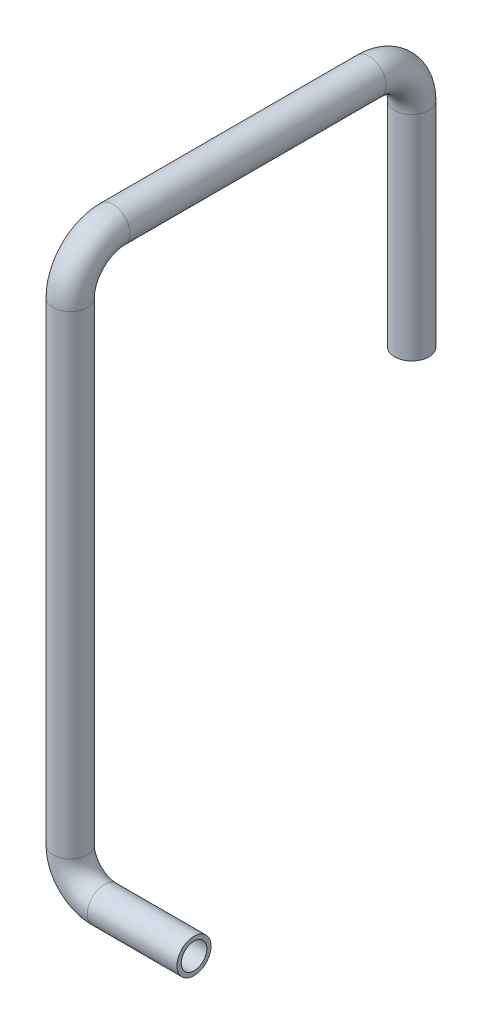
ISO-10303-21;
HEADER;
FILE_DESCRIPTION(('STEP AP214'),'2;1');
FILE_NAME('part.step','',(''),(''),'','','');
FILE_SCHEMA(('AUTOMOTIVE_DESIGN { 1 0 10303 214 1 1 1 1 }'));
ENDSEC;
DATA;
#1=APPLICATION_CONTEXT('core data for automotive mechanical design processes');
#2=APPLICATION_PROTOCOL_DEFINITION('international standard','automotive_design',2000,#1);
#3=PRODUCT_CONTEXT('',#1,'mechanical');
#4=PRODUCT('Part','Part','',(#3));
#5=PRODUCT_RELATED_PRODUCT_CATEGORY('part','',(#4));
#6=PRODUCT_DEFINITION_FORMATION('','',#4);
#7=PRODUCT_DEFINITION_CONTEXT('part definition',#1,'design');
#8=PRODUCT_DEFINITION('design','',#6,#7);
#9=PRODUCT_DEFINITION_SHAPE('','',#8);
#10=(LENGTH_UNIT() NAMED_UNIT(*) SI_UNIT(.MILLI.,.METRE.));
#11=(NAMED_UNIT(*) PLANE_ANGLE_UNIT() SI_UNIT($,.RADIAN.));
#12=(NAMED_UNIT(*) SI_UNIT($,.STERADIAN.) SOLID_ANGLE_UNIT());
#13=UNCERTAINTY_MEASURE_WITH_UNIT(LENGTH_MEASURE(1.E-05),#10,'distance_accuracy_value','');
#14=(GEOMETRIC_REPRESENTATION_CONTEXT(3) GLOBAL_UNCERTAINTY_ASSIGNED_CONTEXT((#13)) GLOBAL_UNIT_ASSIGNED_CONTEXT((#10,
#11,#12)) REPRESENTATION_CONTEXT('',''));
#15=CARTESIAN_POINT('',(0.,0.,0.));
#16=DIRECTION('',(0.,0.,1.));
#17=DIRECTION('',(1.,0.,0.));
#18=AXIS2_PLACEMENT_3D('',#15,#16,#17);
#19=CARTESIAN_POINT('',(59.,21.,40.));
#20=DIRECTION('',(1.,0.,0.));
#21=DIRECTION('',(0.,0.,-1.));
#22=AXIS2_PLACEMENT_3D('',#19,#20,#21);
#23=PLANE('',#22);
#24=CARTESIAN_POINT('',(59.,21.,40.));
#25=DIRECTION('',(1.,0.,0.));
#26=DIRECTION('',(0.,0.,-1.));
#27=AXIS2_PLACEMENT_3D('',#24,#25,#26);
#28=CIRCLE('',#27,3.);
#29=CARTESIAN_POINT('',(59.,21.,37.));
#30=VERTEX_POINT('',#29);
#31=EDGE_CURVE('E263',#30,#30,#28,.T.);
#32=ORIENTED_EDGE('',*,*,#31,.F.);
#33=EDGE_LOOP('',(#32));
#34=FACE_BOUND('',#33,.T.);
#35=CARTESIAN_POINT('',(59.,21.,40.));
#36=DIRECTION('',(1.,0.,0.));
#37=DIRECTION('',(0.,0.,-1.));
#38=AXIS2_PLACEMENT_3D('',#35,#36,#37);
#39=CIRCLE('',#38,4.);
#40=CARTESIAN_POINT('',(59.,21.,36.));
#41=VERTEX_POINT('',#40);
#42=EDGE_CURVE('E75',#41,#41,#39,.T.);
#43=ORIENTED_EDGE('',*,*,#42,.T.);
#44=EDGE_LOOP('',(#43));
#45=FACE_BOUND('',#44,.T.);
#46=ADVANCED_FACE('F52',(#34,#45),#23,.T.);
#47=CARTESIAN_POINT('',(30.,90.,-40.));
#48=DIRECTION('',(0.,1.,0.));
#49=DIRECTION('',(0.,0.,1.));
#50=AXIS2_PLACEMENT_3D('',#47,#48,#49);
#51=PLANE('',#50);
#52=CARTESIAN_POINT('',(30.,90.,-40.));
#53=DIRECTION('',(0.,1.,0.));
#54=DIRECTION('',(0.,0.,1.));
#55=AXIS2_PLACEMENT_3D('',#52,#53,#54);
#56=CIRCLE('',#55,3.);
#57=CARTESIAN_POINT('',(30.,90.,-37.));
#58=VERTEX_POINT('',#57);
#59=EDGE_CURVE('E73',#58,#58,#56,.T.);
#60=ORIENTED_EDGE('',*,*,#59,.T.);
#61=EDGE_LOOP('',(#60));
#62=FACE_BOUND('',#61,.T.);
#63=CARTESIAN_POINT('',(30.,90.,-40.));
#64=DIRECTION('',(0.,1.,0.));
#65=DIRECTION('',(0.,0.,1.));
#66=AXIS2_PLACEMENT_3D('',#63,#64,#65);
#67=CIRCLE('',#66,4.);
#68=CARTESIAN_POINT('',(30.,90.,-36.));
#69=VERTEX_POINT('',#68);
#70=EDGE_CURVE('E11',#69,#69,#67,.T.);
#71=ORIENTED_EDGE('',*,*,#70,.F.);
#72=EDGE_LOOP('',(#71));
#73=FACE_BOUND('',#72,.T.);
#74=ADVANCED_FACE('F149',(#62,#73),#51,.F.);
#75=CARTESIAN_POINT('',(59.,21.,40.));
#76=DIRECTION('',(-1.,0.,0.));
#77=DIRECTION('',(0.,0.,1.));
#78=AXIS2_PLACEMENT_3D('',#75,#76,#77);
#79=CYLINDRICAL_SURFACE('',#78,4.);
#80=CARTESIAN_POINT('',(38.,21.,40.));
#81=DIRECTION('',(-1.,0.,0.));
#82=DIRECTION('',(0.,0.,1.));
#83=AXIS2_PLACEMENT_3D('',#80,#81,#82);
#84=CIRCLE('',#83,4.);
#85=CARTESIAN_POINT('',(38.,17.,40.));
#86=VERTEX_POINT('',#85);
#87=EDGE_CURVE('E74',#86,#86,#84,.F.);
#88=ORIENTED_EDGE('',*,*,#87,.T.);
#89=EDGE_LOOP('',(#88));
#90=FACE_BOUND('',#89,.T.);
#91=ORIENTED_EDGE('',*,*,#42,.F.);
#92=EDGE_LOOP('',(#91));
#93=FACE_BOUND('',#92,.T.);
#94=ADVANCED_FACE('F155',(#90,#93),#79,.T.);
#95=CARTESIAN_POINT('',(38.,29.,40.));
#96=DIRECTION('',(0.,0.,-1.));
#97=DIRECTION('',(-1.,0.,0.));
#98=AXIS2_PLACEMENT_3D('',#95,#96,#97);
#99=TOROIDAL_SURFACE('',#98,8.,4.);
#100=CARTESIAN_POINT('',(30.,29.,40.));
#101=DIRECTION('',(0.,-1.,0.));
#102=DIRECTION('',(1.,0.,0.));
#103=AXIS2_PLACEMENT_3D('',#100,#101,#102);
#104=CIRCLE('',#103,4.);
#105=CARTESIAN_POINT('',(26.,29.,40.));
#106=VERTEX_POINT('',#105);
#107=EDGE_CURVE('E78',#106,#106,#104,.T.);
#108=CARTESIAN_POINT('',(38.,29.,40.));
#109=DIRECTION('',(0.,0.,-1.));
#110=DIRECTION('',(-1.,0.,0.));
#111=AXIS2_PLACEMENT_3D('',#108,#109,#110);
#112=CIRCLE('',#111,12.);
#113=EDGE_CURVE('',#86,#106,#112,.T.);
#114=ORIENTED_EDGE('',*,*,#87,.F.);
#115=ORIENTED_EDGE('',*,*,#107,.T.);
#116=ORIENTED_EDGE('',*,*,#113,.T.);
#117=ORIENTED_EDGE('',*,*,#113,.F.);
#118=EDGE_LOOP('',(#114,#116,#115,#117));
#119=FACE_BOUND('',#118,.T.);
#120=ADVANCED_FACE('F158',(#119),#99,.T.);
#121=CARTESIAN_POINT('',(30.,29.,40.));
#122=DIRECTION('',(0.,1.,0.));
#123=DIRECTION('',(0.,0.,1.));
#124=AXIS2_PLACEMENT_3D('',#121,#122,#123);
#125=CYLINDRICAL_SURFACE('',#124,4.);
#126=CARTESIAN_POINT('',(30.,140.,40.));
#127=DIRECTION('',(0.,1.,0.));
#128=DIRECTION('',(0.,0.,1.));
#129=AXIS2_PLACEMENT_3D('',#126,#127,#128);
#130=CIRCLE('',#129,4.);
#131=CARTESIAN_POINT('',(30.,140.,44.));
#132=VERTEX_POINT('',#131);
#133=EDGE_CURVE('E91',#132,#132,#130,.F.);
#134=ORIENTED_EDGE('',*,*,#133,.T.);
#135=EDGE_LOOP('',(#134));
#136=FACE_BOUND('',#135,.T.);
#137=ORIENTED_EDGE('',*,*,#107,.F.);
#138=EDGE_LOOP('',(#137));
#139=FACE_BOUND('',#138,.T.);
#140=ADVANCED_FACE('F109',(#136,#139),#125,.T.);
#141=CARTESIAN_POINT('',(30.,140.,30.));
#142=DIRECTION('',(-1.,0.,0.));
#143=DIRECTION('',(0.,0.,1.));
#144=AXIS2_PLACEMENT_3D('',#141,#142,#143);
#145=TOROIDAL_SURFACE('',#144,10.,4.);
#146=CARTESIAN_POINT('',(30.,150.,30.));
#147=DIRECTION('',(0.,0.,1.));
#148=DIRECTION('',(0.,-1.,0.));
#149=AXIS2_PLACEMENT_3D('',#146,#147,#148);
#150=CIRCLE('',#149,4.);
#151=CARTESIAN_POINT('',(30.,154.,30.));
#152=VERTEX_POINT('',#151);
#153=EDGE_CURVE('E68',#152,#152,#150,.T.);
#154=CARTESIAN_POINT('',(30.,140.,30.));
#155=DIRECTION('',(-1.,0.,0.));
#156=DIRECTION('',(0.,0.,1.));
#157=AXIS2_PLACEMENT_3D('',#154,#155,#156);
#158=CIRCLE('',#157,14.);
#159=EDGE_CURVE('',#132,#152,#158,.T.);
#160=ORIENTED_EDGE('',*,*,#133,.F.);
#161=ORIENTED_EDGE('',*,*,#153,.T.);
#162=ORIENTED_EDGE('',*,*,#159,.T.);
#163=ORIENTED_EDGE('',*,*,#159,.F.);
#164=EDGE_LOOP('',(#160,#162,#161,#163));
#165=FACE_BOUND('',#164,.T.);
#166=ADVANCED_FACE('F98',(#165),#145,.T.);
#167=CARTESIAN_POINT('',(30.,150.,30.));
#168=DIRECTION('',(0.,0.,-1.));
#169=DIRECTION('',(-1.,0.,0.));
#170=AXIS2_PLACEMENT_3D('',#167,#168,#169);
#171=CYLINDRICAL_SURFACE('',#170,4.);
#172=CARTESIAN_POINT('',(30.,150.,-30.));
#173=DIRECTION('',(0.,0.,-1.));
#174=DIRECTION('',(-1.,0.,0.));
#175=AXIS2_PLACEMENT_3D('',#172,#173,#174);
#176=CIRCLE('',#175,4.);
#177=CARTESIAN_POINT('',(30.,154.,-30.));
#178=VERTEX_POINT('',#177);
#179=EDGE_CURVE('E63',#178,#178,#176,.F.);
#180=ORIENTED_EDGE('',*,*,#179,.T.);
#181=EDGE_LOOP('',(#180));
#182=FACE_BOUND('',#181,.T.);
#183=ORIENTED_EDGE('',*,*,#153,.F.);
#184=EDGE_LOOP('',(#183));
#185=FACE_BOUND('',#184,.T.);
#186=ADVANCED_FACE('F101',(#182,#185),#171,.T.);
#187=CARTESIAN_POINT('',(30.,140.,-30.));
#188=DIRECTION('',(-1.,0.,0.));
#189=DIRECTION('',(0.,0.,1.));
#190=AXIS2_PLACEMENT_3D('',#187,#188,#189);
#191=TOROIDAL_SURFACE('',#190,10.,4.);
#192=CARTESIAN_POINT('',(30.,140.,-40.));
#193=DIRECTION('',(0.,1.,0.));
#194=DIRECTION('',(0.,0.,1.));
#195=AXIS2_PLACEMENT_3D('',#192,#193,#194);
#196=CIRCLE('',#195,4.);
#197=CARTESIAN_POINT('',(30.,140.,-44.));
#198=VERTEX_POINT('',#197);
#199=EDGE_CURVE('E58',#198,#198,#196,.T.);
#200=CARTESIAN_POINT('',(30.,140.,-30.));
#201=DIRECTION('',(-1.,0.,0.));
#202=DIRECTION('',(0.,0.,1.));
#203=AXIS2_PLACEMENT_3D('',#200,#201,#202);
#204=CIRCLE('',#203,14.);
#205=EDGE_CURVE('',#178,#198,#204,.T.);
#206=ORIENTED_EDGE('',*,*,#179,.F.);
#207=ORIENTED_EDGE('',*,*,#199,.T.);
#208=ORIENTED_EDGE('',*,*,#205,.T.);
#209=ORIENTED_EDGE('',*,*,#205,.F.);
#210=EDGE_LOOP('',(#206,#208,#207,#209));
#211=FACE_BOUND('',#210,.T.);
#212=ADVANCED_FACE('F103',(#211),#191,.T.);
#213=CARTESIAN_POINT('',(30.,140.,-40.));
#214=DIRECTION('',(0.,-1.,0.));
#215=DIRECTION('',(0.,0.,-1.));
#216=AXIS2_PLACEMENT_3D('',#213,#214,#215);
#217=CYLINDRICAL_SURFACE('',#216,4.);
#218=ORIENTED_EDGE('',*,*,#70,.T.);
#219=EDGE_LOOP('',(#218));
#220=FACE_BOUND('',#219,.T.);
#221=ORIENTED_EDGE('',*,*,#199,.F.);
#222=EDGE_LOOP('',(#221));
#223=FACE_BOUND('',#222,.T.);
#224=ADVANCED_FACE('F54',(#220,#223),#217,.T.);
#225=CARTESIAN_POINT('',(59.,21.,40.));
#226=DIRECTION('',(-1.,0.,0.));
#227=DIRECTION('',(0.,0.,1.));
#228=AXIS2_PLACEMENT_3D('',#225,#226,#227);
#229=CYLINDRICAL_SURFACE('',#228,3.);
#230=CARTESIAN_POINT('',(38.,21.,40.));
#231=DIRECTION('',(1.,0.,0.));
#232=DIRECTION('',(0.,0.,-1.));
#233=AXIS2_PLACEMENT_3D('',#230,#231,#232);
#234=CIRCLE('',#233,3.);
#235=CARTESIAN_POINT('',(38.,18.,40.));
#236=VERTEX_POINT('',#235);
#237=EDGE_CURVE('E262',#236,#236,#234,.T.);
#238=ORIENTED_EDGE('',*,*,#237,.F.);
#239=EDGE_LOOP('',(#238));
#240=FACE_BOUND('',#239,.T.);
#241=ORIENTED_EDGE('',*,*,#31,.T.);
#242=EDGE_LOOP('',(#241));
#243=FACE_BOUND('',#242,.T.);
#244=ADVANCED_FACE('F114',(#240,#243),#229,.F.);
#245=CARTESIAN_POINT('',(38.,29.,40.));
#246=DIRECTION('',(0.,0.,-1.));
#247=DIRECTION('',(-1.,0.,0.));
#248=AXIS2_PLACEMENT_3D('',#245,#246,#247);
#249=TOROIDAL_SURFACE('',#248,8.,3.);
#250=CARTESIAN_POINT('',(30.,29.,40.));
#251=DIRECTION('',(0.,-1.,0.));
#252=DIRECTION('',(0.,0.,-1.));
#253=AXIS2_PLACEMENT_3D('',#250,#251,#252);
#254=CIRCLE('',#253,3.);
#255=CARTESIAN_POINT('',(27.,29.,40.));
#256=VERTEX_POINT('',#255);
#257=EDGE_CURVE('E270',#256,#256,#254,.T.);
#258=CARTESIAN_POINT('',(38.,29.,40.));
#259=DIRECTION('',(0.,0.,-1.));
#260=DIRECTION('',(-1.,0.,0.));
#261=AXIS2_PLACEMENT_3D('',#258,#259,#260);
#262=CIRCLE('',#261,11.);
#263=EDGE_CURVE('',#236,#256,#262,.T.);
#264=ORIENTED_EDGE('',*,*,#237,.T.);
#265=ORIENTED_EDGE('',*,*,#257,.F.);
#266=ORIENTED_EDGE('',*,*,#263,.T.);
#267=ORIENTED_EDGE('',*,*,#263,.F.);
#268=EDGE_LOOP('',(#264,#266,#265,#267));
#269=FACE_BOUND('',#268,.T.);
#270=ADVANCED_FACE('F116',(#269),#249,.F.);
#271=CARTESIAN_POINT('',(30.,29.,40.));
#272=DIRECTION('',(0.,1.,0.));
#273=DIRECTION('',(0.,0.,1.));
#274=AXIS2_PLACEMENT_3D('',#271,#272,#273);
#275=CYLINDRICAL_SURFACE('',#274,3.);
#276=CARTESIAN_POINT('',(30.,140.,40.));
#277=DIRECTION('',(0.,-1.,0.));
#278=DIRECTION('',(0.,0.,-1.));
#279=AXIS2_PLACEMENT_3D('',#276,#277,#278);
#280=CIRCLE('',#279,3.);
#281=CARTESIAN_POINT('',(30.,140.,43.));
#282=VERTEX_POINT('',#281);
#283=EDGE_CURVE('E275',#282,#282,#280,.T.);
#284=ORIENTED_EDGE('',*,*,#283,.F.);
#285=EDGE_LOOP('',(#284));
#286=FACE_BOUND('',#285,.T.);
#287=ORIENTED_EDGE('',*,*,#257,.T.);
#288=EDGE_LOOP('',(#287));
#289=FACE_BOUND('',#288,.T.);
#290=ADVANCED_FACE('F123',(#286,#289),#275,.F.);
#291=CARTESIAN_POINT('',(30.,140.,30.));
#292=DIRECTION('',(-1.,0.,0.));
#293=DIRECTION('',(0.,0.,1.));
#294=AXIS2_PLACEMENT_3D('',#291,#292,#293);
#295=TOROIDAL_SURFACE('',#294,10.,3.);
#296=CARTESIAN_POINT('',(30.,150.,30.));
#297=DIRECTION('',(0.,0.,1.));
#298=DIRECTION('',(0.,-1.,0.));
#299=AXIS2_PLACEMENT_3D('',#296,#297,#298);
#300=CIRCLE('',#299,3.);
#301=CARTESIAN_POINT('',(30.,153.,30.));
#302=VERTEX_POINT('',#301);
#303=EDGE_CURVE('E274',#302,#302,#300,.T.);
#304=CARTESIAN_POINT('',(30.,140.,30.));
#305=DIRECTION('',(-1.,0.,0.));
#306=DIRECTION('',(0.,0.,1.));
#307=AXIS2_PLACEMENT_3D('',#304,#305,#306);
#308=CIRCLE('',#307,13.);
#309=EDGE_CURVE('',#282,#302,#308,.T.);
#310=ORIENTED_EDGE('',*,*,#283,.T.);
#311=ORIENTED_EDGE('',*,*,#303,.F.);
#312=ORIENTED_EDGE('',*,*,#309,.T.);
#313=ORIENTED_EDGE('',*,*,#309,.F.);
#314=EDGE_LOOP('',(#310,#312,#311,#313));
#315=FACE_BOUND('',#314,.T.);
#316=ADVANCED_FACE('F131',(#315),#295,.F.);
#317=CARTESIAN_POINT('',(30.,150.,30.));
#318=DIRECTION('',(0.,0.,-1.));
#319=DIRECTION('',(-1.,0.,0.));
#320=AXIS2_PLACEMENT_3D('',#317,#318,#319);
#321=CYLINDRICAL_SURFACE('',#320,3.);
#322=CARTESIAN_POINT('',(30.,150.,-30.));
#323=DIRECTION('',(0.,0.,1.));
#324=DIRECTION('',(0.,-1.,0.));
#325=AXIS2_PLACEMENT_3D('',#322,#323,#324);
#326=CIRCLE('',#325,3.);
#327=CARTESIAN_POINT('',(30.,153.,-30.));
#328=VERTEX_POINT('',#327);
#329=EDGE_CURVE('E87',#328,#328,#326,.T.);
#330=ORIENTED_EDGE('',*,*,#329,.F.);
#331=EDGE_LOOP('',(#330));
#332=FACE_BOUND('',#331,.T.);
#333=ORIENTED_EDGE('',*,*,#303,.T.);
#334=EDGE_LOOP('',(#333));
#335=FACE_BOUND('',#334,.T.);
#336=ADVANCED_FACE('F136',(#332,#335),#321,.F.);
#337=CARTESIAN_POINT('',(30.,140.,-30.));
#338=DIRECTION('',(-1.,0.,0.));
#339=DIRECTION('',(0.,0.,1.));
#340=AXIS2_PLACEMENT_3D('',#337,#338,#339);
#341=TOROIDAL_SURFACE('',#340,10.,3.);
#342=CARTESIAN_POINT('',(30.,140.,-40.0000000000003));
#343=DIRECTION('',(0.,1.,0.));
#344=DIRECTION('',(0.,0.,1.));
#345=AXIS2_PLACEMENT_3D('',#342,#343,#344);
#346=CIRCLE('',#345,3.);
#347=CARTESIAN_POINT('',(30.,140.,-43.));
#348=VERTEX_POINT('',#347);
#349=EDGE_CURVE('E85',#348,#348,#346,.T.);
#350=CARTESIAN_POINT('',(30.,140.,-30.));
#351=DIRECTION('',(-1.,0.,0.));
#352=DIRECTION('',(0.,0.,1.));
#353=AXIS2_PLACEMENT_3D('',#350,#351,#352);
#354=CIRCLE('',#353,13.);
#355=EDGE_CURVE('',#328,#348,#354,.T.);
#356=ORIENTED_EDGE('',*,*,#329,.T.);
#357=ORIENTED_EDGE('',*,*,#349,.F.);
#358=ORIENTED_EDGE('',*,*,#355,.T.);
#359=ORIENTED_EDGE('',*,*,#355,.F.);
#360=EDGE_LOOP('',(#356,#358,#357,#359));
#361=FACE_BOUND('',#360,.T.);
#362=ADVANCED_FACE('F139',(#361),#341,.F.);
#363=CARTESIAN_POINT('',(30.,140.,-40.));
#364=DIRECTION('',(0.,-1.,0.));
#365=DIRECTION('',(0.,0.,-1.));
#366=AXIS2_PLACEMENT_3D('',#363,#364,#365);
#367=CYLINDRICAL_SURFACE('',#366,3.);
#368=ORIENTED_EDGE('',*,*,#59,.F.);
#369=EDGE_LOOP('',(#368));
#370=FACE_BOUND('',#369,.T.);
#371=ORIENTED_EDGE('',*,*,#349,.T.);
#372=EDGE_LOOP('',(#371));
#373=FACE_BOUND('',#372,.T.);
#374=ADVANCED_FACE('F145',(#370,#373),#367,.F.);
#375=CLOSED_SHELL('',(#46,#74,#94,#120,#140,#166,#186,#212,#224,#244,#270,#290,#316,#336,#362,#374));
#376=MANIFOLD_SOLID_BREP('B2',#375);
#377=ADVANCED_BREP_SHAPE_REPRESENTATION('',(#18,#376),#14);
#378=SHAPE_DEFINITION_REPRESENTATION(#9,#377);
ENDSEC;
END-ISO-10303-21;
